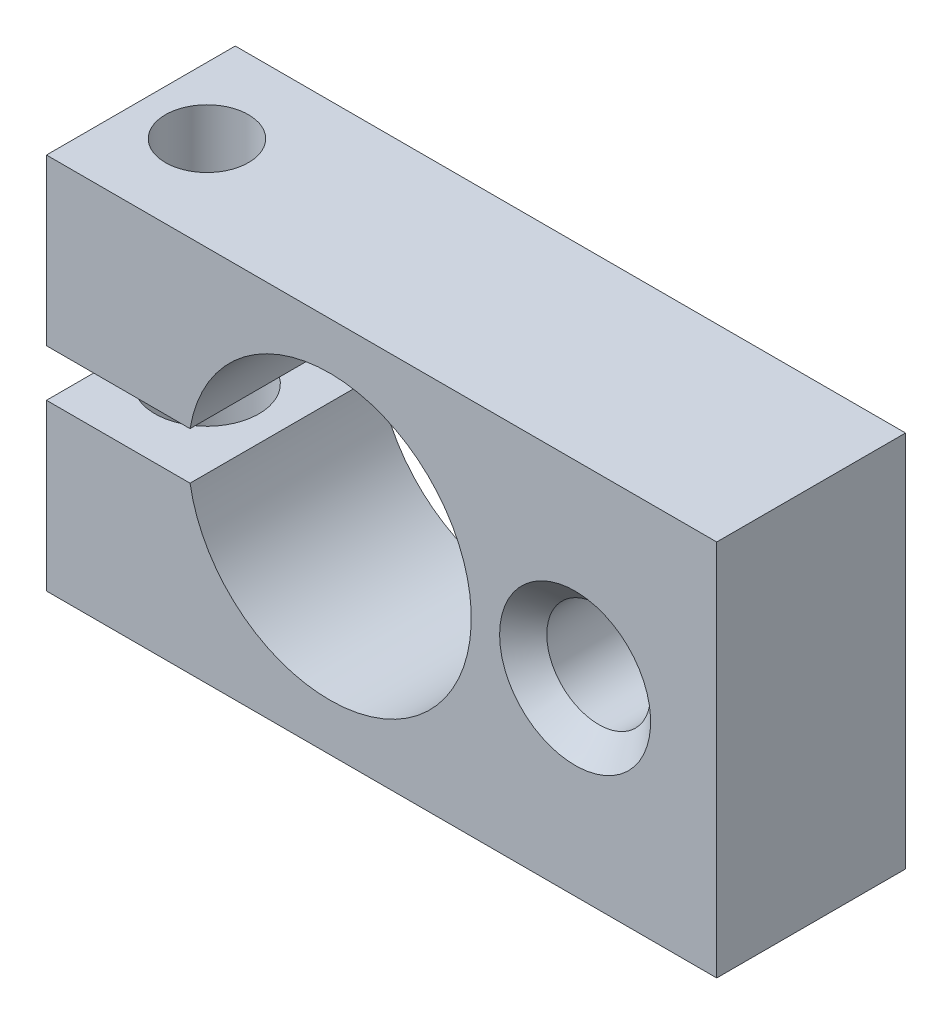
ISO-10303-21;
HEADER;
FILE_DESCRIPTION(('STEP AP214'),'2;1');
FILE_NAME('part.step','',(''),(''),'','','');
FILE_SCHEMA(('AUTOMOTIVE_DESIGN { 1 0 10303 214 1 1 1 1 }'));
ENDSEC;
DATA;
#1=APPLICATION_CONTEXT('core data for automotive mechanical design processes');
#2=APPLICATION_PROTOCOL_DEFINITION('international standard','automotive_design',2000,#1);
#3=PRODUCT_CONTEXT('',#1,'mechanical');
#4=PRODUCT('Part','Part','',(#3));
#5=PRODUCT_RELATED_PRODUCT_CATEGORY('part','',(#4));
#6=PRODUCT_DEFINITION_FORMATION('','',#4);
#7=PRODUCT_DEFINITION_CONTEXT('part definition',#1,'design');
#8=PRODUCT_DEFINITION('design','',#6,#7);
#9=PRODUCT_DEFINITION_SHAPE('','',#8);
#10=(LENGTH_UNIT() NAMED_UNIT(*) SI_UNIT(.MILLI.,.METRE.));
#11=(NAMED_UNIT(*) PLANE_ANGLE_UNIT() SI_UNIT($,.RADIAN.));
#12=(NAMED_UNIT(*) SI_UNIT($,.STERADIAN.) SOLID_ANGLE_UNIT());
#13=UNCERTAINTY_MEASURE_WITH_UNIT(LENGTH_MEASURE(1.E-05),#10,'distance_accuracy_value','');
#14=(GEOMETRIC_REPRESENTATION_CONTEXT(3) GLOBAL_UNCERTAINTY_ASSIGNED_CONTEXT((#13)) GLOBAL_UNIT_ASSIGNED_CONTEXT((#10,
#11,#12)) REPRESENTATION_CONTEXT('',''));
#15=CARTESIAN_POINT('',(0.,0.,0.));
#16=DIRECTION('',(0.,0.,1.));
#17=DIRECTION('',(1.,0.,0.));
#18=AXIS2_PLACEMENT_3D('',#15,#16,#17);
#19=CARTESIAN_POINT('',(-30.,-2.5,10.));
#20=DIRECTION('',(1.,0.,0.));
#21=DIRECTION('',(0.,0.,-1.));
#22=AXIS2_PLACEMENT_3D('',#19,#20,#21);
#23=PLANE('',#22);
#24=DIRECTION('',(0.,-1.,0.));
#25=VECTOR('',#24,1.);
#26=CARTESIAN_POINT('',(-30.,-2.50000000000002,-9.99999999999998));
#27=LINE('',#26,#25);
#28=CARTESIAN_POINT('',(-30.,-2.50000000000002,-9.99999999999998));
#29=VERTEX_POINT('',#28);
#30=CARTESIAN_POINT('',(-30.,-20.,-9.9999999999999));
#31=VERTEX_POINT('',#30);
#32=EDGE_CURVE('E86',#29,#31,#27,.T.);
#33=ORIENTED_EDGE('',*,*,#32,.T.);
#34=DIRECTION('',(0.,0.,-1.));
#35=VECTOR('',#34,1.);
#36=CARTESIAN_POINT('',(-30.,-20.,10.0000000000001));
#37=LINE('',#36,#35);
#38=CARTESIAN_POINT('',(-30.,-20.,10.0000000000001));
#39=VERTEX_POINT('',#38);
#40=EDGE_CURVE('E95',#39,#31,#37,.T.);
#41=ORIENTED_EDGE('',*,*,#40,.F.);
#42=DIRECTION('',(0.,-1.,0.));
#43=VECTOR('',#42,1.);
#44=CARTESIAN_POINT('',(-30.,-2.5,10.));
#45=LINE('',#44,#43);
#46=CARTESIAN_POINT('',(-30.,-2.5,10.));
#47=VERTEX_POINT('',#46);
#48=EDGE_CURVE('E120',#47,#39,#45,.T.);
#49=ORIENTED_EDGE('',*,*,#48,.F.);
#50=DIRECTION('',(0.,0.,-1.));
#51=VECTOR('',#50,1.);
#52=CARTESIAN_POINT('',(-30.,-2.5,10.));
#53=LINE('',#52,#51);
#54=EDGE_CURVE('E104',#47,#29,#53,.T.);
#55=ORIENTED_EDGE('',*,*,#54,.T.);
#56=EDGE_LOOP('',(#33,#41,#49,#55));
#57=FACE_BOUND('',#56,.T.);
#58=ADVANCED_FACE('F17',(#57),#23,.F.);
#59=CARTESIAN_POINT('',(-30.,-20.,10.0000000000001));
#60=DIRECTION('',(0.,1.,0.));
#61=DIRECTION('',(0.,0.,1.));
#62=AXIS2_PLACEMENT_3D('',#59,#60,#61);
#63=PLANE('',#62);
#64=CARTESIAN_POINT('',(-23.,-20.,1.11022302462516E-13));
#65=DIRECTION('',(0.,-1.,0.));
#66=DIRECTION('',(0.,0.,-1.));
#67=AXIS2_PLACEMENT_3D('',#64,#65,#66);
#68=CIRCLE('',#67,5.5);
#69=CARTESIAN_POINT('',(-23.,-20.,-5.49999999999989));
#70=VERTEX_POINT('',#69);
#71=EDGE_CURVE('E112',#70,#70,#68,.T.);
#72=ORIENTED_EDGE('',*,*,#71,.F.);
#73=EDGE_LOOP('',(#72));
#74=FACE_BOUND('',#73,.T.);
#75=DIRECTION('',(1.,0.,0.));
#76=VECTOR('',#75,1.);
#77=CARTESIAN_POINT('',(-30.,-20.,-9.9999999999999));
#78=LINE('',#77,#76);
#79=CARTESIAN_POINT('',(41.,-20.,-9.9999999999999));
#80=VERTEX_POINT('',#79);
#81=EDGE_CURVE('E81',#31,#80,#78,.T.);
#82=ORIENTED_EDGE('',*,*,#81,.T.);
#83=DIRECTION('',(0.,0.,-1.));
#84=VECTOR('',#83,1.);
#85=CARTESIAN_POINT('',(41.,-20.,10.0000000000001));
#86=LINE('',#85,#84);
#87=CARTESIAN_POINT('',(41.,-20.,10.0000000000001));
#88=VERTEX_POINT('',#87);
#89=EDGE_CURVE('E101',#88,#80,#86,.T.);
#90=ORIENTED_EDGE('',*,*,#89,.F.);
#91=DIRECTION('',(1.,0.,0.));
#92=VECTOR('',#91,1.);
#93=CARTESIAN_POINT('',(-30.,-20.,10.0000000000001));
#94=LINE('',#93,#92);
#95=EDGE_CURVE('E97',#39,#88,#94,.T.);
#96=ORIENTED_EDGE('',*,*,#95,.F.);
#97=ORIENTED_EDGE('',*,*,#40,.T.);
#98=EDGE_LOOP('',(#82,#90,#96,#97));
#99=FACE_BOUND('',#98,.T.);
#100=ADVANCED_FACE('F96',(#74,#99),#63,.F.);
#101=CARTESIAN_POINT('',(41.,-20.,10.0000000000001));
#102=DIRECTION('',(-1.,0.,0.));
#103=DIRECTION('',(0.,0.,1.));
#104=AXIS2_PLACEMENT_3D('',#101,#102,#103);
#105=PLANE('',#104);
#106=DIRECTION('',(0.,1.,0.));
#107=VECTOR('',#106,1.);
#108=CARTESIAN_POINT('',(41.,-20.,-9.9999999999999));
#109=LINE('',#108,#107);
#110=CARTESIAN_POINT('',(41.,20.,-9.99999999999998));
#111=VERTEX_POINT('',#110);
#112=EDGE_CURVE('E88',#80,#111,#109,.T.);
#113=ORIENTED_EDGE('',*,*,#112,.T.);
#114=DIRECTION('',(0.,0.,-1.));
#115=VECTOR('',#114,1.);
#116=CARTESIAN_POINT('',(41.,20.,10.));
#117=LINE('',#116,#115);
#118=CARTESIAN_POINT('',(41.,20.,10.));
#119=VERTEX_POINT('',#118);
#120=EDGE_CURVE('E144',#119,#111,#117,.T.);
#121=ORIENTED_EDGE('',*,*,#120,.F.);
#122=DIRECTION('',(0.,1.,0.));
#123=VECTOR('',#122,1.);
#124=CARTESIAN_POINT('',(41.,-20.,10.0000000000001));
#125=LINE('',#124,#123);
#126=EDGE_CURVE('E119',#88,#119,#125,.T.);
#127=ORIENTED_EDGE('',*,*,#126,.F.);
#128=ORIENTED_EDGE('',*,*,#89,.T.);
#129=EDGE_LOOP('',(#113,#121,#127,#128));
#130=FACE_BOUND('',#129,.T.);
#131=ADVANCED_FACE('F183',(#130),#105,.F.);
#132=CARTESIAN_POINT('',(41.,20.,10.));
#133=DIRECTION('',(0.,-1.,0.));
#134=DIRECTION('',(0.,0.,-1.));
#135=AXIS2_PLACEMENT_3D('',#132,#133,#134);
#136=PLANE('',#135);
#137=CARTESIAN_POINT('',(-23.,20.,1.11022302462516E-13));
#138=DIRECTION('',(0.,1.,0.));
#139=DIRECTION('',(0.,0.,1.));
#140=AXIS2_PLACEMENT_3D('',#137,#138,#139);
#141=CIRCLE('',#140,4.4);
#142=CARTESIAN_POINT('',(-23.,20.,4.40000000000011));
#143=VERTEX_POINT('',#142);
#144=EDGE_CURVE('E223',#143,#143,#141,.T.);
#145=ORIENTED_EDGE('',*,*,#144,.F.);
#146=EDGE_LOOP('',(#145));
#147=FACE_BOUND('',#146,.T.);
#148=DIRECTION('',(-1.,0.,0.));
#149=VECTOR('',#148,1.);
#150=CARTESIAN_POINT('',(41.,20.,-9.99999999999998));
#151=LINE('',#150,#149);
#152=CARTESIAN_POINT('',(-30.,20.,-9.9999999999999));
#153=VERTEX_POINT('',#152);
#154=EDGE_CURVE('E213',#111,#153,#151,.T.);
#155=ORIENTED_EDGE('',*,*,#154,.T.);
#156=DIRECTION('',(0.,0.,-1.));
#157=VECTOR('',#156,1.);
#158=CARTESIAN_POINT('',(-30.,20.,10.0000000000001));
#159=LINE('',#158,#157);
#160=CARTESIAN_POINT('',(-30.,20.,10.0000000000001));
#161=VERTEX_POINT('',#160);
#162=EDGE_CURVE('E141',#161,#153,#159,.T.);
#163=ORIENTED_EDGE('',*,*,#162,.F.);
#164=DIRECTION('',(-1.,0.,0.));
#165=VECTOR('',#164,1.);
#166=CARTESIAN_POINT('',(41.,20.,10.));
#167=LINE('',#166,#165);
#168=EDGE_CURVE('E122',#119,#161,#167,.T.);
#169=ORIENTED_EDGE('',*,*,#168,.F.);
#170=ORIENTED_EDGE('',*,*,#120,.T.);
#171=EDGE_LOOP('',(#155,#163,#169,#170));
#172=FACE_BOUND('',#171,.T.);
#173=ADVANCED_FACE('F187',(#147,#172),#136,.F.);
#174=CARTESIAN_POINT('',(-30.,20.,10.0000000000001));
#175=DIRECTION('',(1.,0.,0.));
#176=DIRECTION('',(0.,0.,-1.));
#177=AXIS2_PLACEMENT_3D('',#174,#175,#176);
#178=PLANE('',#177);
#179=DIRECTION('',(0.,-1.,0.));
#180=VECTOR('',#179,1.);
#181=CARTESIAN_POINT('',(-30.,20.,-9.9999999999999));
#182=LINE('',#181,#180);
#183=CARTESIAN_POINT('',(-30.,2.5,-9.9999999999999));
#184=VERTEX_POINT('',#183);
#185=EDGE_CURVE('E195',#153,#184,#182,.T.);
#186=ORIENTED_EDGE('',*,*,#185,.T.);
#187=DIRECTION('',(0.,0.,-1.));
#188=VECTOR('',#187,1.);
#189=CARTESIAN_POINT('',(-30.,2.5,10.0000000000001));
#190=LINE('',#189,#188);
#191=CARTESIAN_POINT('',(-30.,2.5,10.0000000000001));
#192=VERTEX_POINT('',#191);
#193=EDGE_CURVE('E138',#192,#184,#190,.T.);
#194=ORIENTED_EDGE('',*,*,#193,.F.);
#195=DIRECTION('',(0.,-1.,0.));
#196=VECTOR('',#195,1.);
#197=CARTESIAN_POINT('',(-30.,20.,10.0000000000001));
#198=LINE('',#197,#196);
#199=EDGE_CURVE('E124',#161,#192,#198,.T.);
#200=ORIENTED_EDGE('',*,*,#199,.F.);
#201=ORIENTED_EDGE('',*,*,#162,.T.);
#202=EDGE_LOOP('',(#186,#194,#200,#201));
#203=FACE_BOUND('',#202,.T.);
#204=ADVANCED_FACE('F193',(#203),#178,.F.);
#205=CARTESIAN_POINT('',(-30.,2.5,10.0000000000001));
#206=DIRECTION('',(0.,1.,0.));
#207=DIRECTION('',(0.,0.,1.));
#208=AXIS2_PLACEMENT_3D('',#205,#206,#207);
#209=PLANE('',#208);
#210=CARTESIAN_POINT('',(-23.,2.5,1.11022302462516E-13));
#211=DIRECTION('',(0.,1.,0.));
#212=DIRECTION('',(0.,0.,1.));
#213=AXIS2_PLACEMENT_3D('',#210,#211,#212);
#214=CIRCLE('',#213,4.4);
#215=CARTESIAN_POINT('',(-23.,2.5,4.40000000000011));
#216=VERTEX_POINT('',#215);
#217=EDGE_CURVE('E220',#216,#216,#214,.T.);
#218=ORIENTED_EDGE('',*,*,#217,.T.);
#219=EDGE_LOOP('',(#218));
#220=FACE_BOUND('',#219,.T.);
#221=DIRECTION('',(1.,0.,0.));
#222=VECTOR('',#221,1.);
#223=CARTESIAN_POINT('',(-30.,2.5,-9.9999999999999));
#224=LINE('',#223,#222);
#225=CARTESIAN_POINT('',(-14.790199457749,2.50000000000001,-9.9999999999999));
#226=VERTEX_POINT('',#225);
#227=EDGE_CURVE('E199',#184,#226,#224,.T.);
#228=ORIENTED_EDGE('',*,*,#227,.T.);
#229=DIRECTION('',(0.,0.,-1.));
#230=VECTOR('',#229,1.);
#231=CARTESIAN_POINT('',(-14.790199457749,2.5,10.0000000000001));
#232=LINE('',#231,#230);
#233=CARTESIAN_POINT('',(-14.790199457749,2.5,10.0000000000001));
#234=VERTEX_POINT('',#233);
#235=EDGE_CURVE('E135',#234,#226,#232,.T.);
#236=ORIENTED_EDGE('',*,*,#235,.F.);
#237=DIRECTION('',(1.,0.,0.));
#238=VECTOR('',#237,1.);
#239=CARTESIAN_POINT('',(-30.,2.5,10.0000000000001));
#240=LINE('',#239,#238);
#241=EDGE_CURVE('E126',#192,#234,#240,.T.);
#242=ORIENTED_EDGE('',*,*,#241,.F.);
#243=ORIENTED_EDGE('',*,*,#193,.T.);
#244=EDGE_LOOP('',(#228,#236,#242,#243));
#245=FACE_BOUND('',#244,.T.);
#246=ADVANCED_FACE('F198',(#220,#245),#209,.F.);
#247=CARTESIAN_POINT('',(0.,0.,10.));
#248=DIRECTION('',(0.,0.,-1.));
#249=DIRECTION('',(-1.,0.,0.));
#250=AXIS2_PLACEMENT_3D('',#247,#248,#249);
#251=CYLINDRICAL_SURFACE('',#250,15.);
#252=CARTESIAN_POINT('',(0.,0.,-10.));
#253=DIRECTION('',(0.,0.,-1.));
#254=DIRECTION('',(-1.,0.,0.));
#255=AXIS2_PLACEMENT_3D('',#252,#253,#254);
#256=CIRCLE('',#255,15.);
#257=CARTESIAN_POINT('',(-14.790199457749,-2.5,-9.9999999999999));
#258=VERTEX_POINT('',#257);
#259=EDGE_CURVE('E202',#226,#258,#256,.T.);
#260=ORIENTED_EDGE('',*,*,#259,.T.);
#261=DIRECTION('',(0.,0.,-1.));
#262=VECTOR('',#261,1.);
#263=CARTESIAN_POINT('',(-14.790199457749,-2.50000000000001,10.0000000000001));
#264=LINE('',#263,#262);
#265=CARTESIAN_POINT('',(-14.790199457749,-2.50000000000001,10.0000000000001));
#266=VERTEX_POINT('',#265);
#267=EDGE_CURVE('E132',#266,#258,#264,.T.);
#268=ORIENTED_EDGE('',*,*,#267,.F.);
#269=CARTESIAN_POINT('',(0.,0.,10.));
#270=DIRECTION('',(0.,0.,-1.));
#271=DIRECTION('',(-1.,0.,0.));
#272=AXIS2_PLACEMENT_3D('',#269,#270,#271);
#273=CIRCLE('',#272,15.);
#274=EDGE_CURVE('E36',#234,#266,#273,.T.);
#275=ORIENTED_EDGE('',*,*,#274,.F.);
#276=ORIENTED_EDGE('',*,*,#235,.T.);
#277=EDGE_LOOP('',(#260,#268,#275,#276));
#278=FACE_BOUND('',#277,.T.);
#279=ADVANCED_FACE('F167',(#278),#251,.F.);
#280=CARTESIAN_POINT('',(26.,0.,10.));
#281=DIRECTION('',(0.,0.,-1.));
#282=DIRECTION('',(-1.,0.,0.));
#283=AXIS2_PLACEMENT_3D('',#280,#281,#282);
#284=CYLINDRICAL_SURFACE('',#283,5.5);
#285=CARTESIAN_POINT('',(26.,0.,-7.49999999999998));
#286=DIRECTION('',(0.,0.,-1.));
#287=DIRECTION('',(-1.,0.,0.));
#288=AXIS2_PLACEMENT_3D('',#285,#286,#287);
#289=CIRCLE('',#288,5.5);
#290=CARTESIAN_POINT('',(20.5,0.,-7.49999999999998));
#291=VERTEX_POINT('',#290);
#292=EDGE_CURVE('E150',#291,#291,#289,.T.);
#293=ORIENTED_EDGE('',*,*,#292,.T.);
#294=EDGE_LOOP('',(#293));
#295=FACE_BOUND('',#294,.T.);
#296=CARTESIAN_POINT('',(26.,0.,7.50000000000001));
#297=DIRECTION('',(0.,0.,-1.));
#298=DIRECTION('',(-1.,0.,0.));
#299=AXIS2_PLACEMENT_3D('',#296,#297,#298);
#300=CIRCLE('',#299,5.5);
#301=CARTESIAN_POINT('',(20.5,0.,7.50000000000001));
#302=VERTEX_POINT('',#301);
#303=EDGE_CURVE('E100',#302,#302,#300,.F.);
#304=ORIENTED_EDGE('',*,*,#303,.T.);
#305=EDGE_LOOP('',(#304));
#306=FACE_BOUND('',#305,.T.);
#307=ADVANCED_FACE('F163',(#295,#306),#284,.F.);
#308=CARTESIAN_POINT('',(-30.,-2.5,10.));
#309=DIRECTION('',(0.,-1.,0.));
#310=DIRECTION('',(0.,0.,-1.));
#311=AXIS2_PLACEMENT_3D('',#308,#309,#310);
#312=PLANE('',#311);
#313=CARTESIAN_POINT('',(-23.,-2.5,1.11022302462516E-13));
#314=DIRECTION('',(0.,-1.,0.));
#315=DIRECTION('',(0.,0.,-1.));
#316=AXIS2_PLACEMENT_3D('',#313,#314,#315);
#317=CIRCLE('',#316,5.5);
#318=CARTESIAN_POINT('',(-23.,-2.5,-5.49999999999989));
#319=VERTEX_POINT('',#318);
#320=EDGE_CURVE('E106',#319,#319,#317,.T.);
#321=ORIENTED_EDGE('',*,*,#320,.T.);
#322=EDGE_LOOP('',(#321));
#323=FACE_BOUND('',#322,.T.);
#324=DIRECTION('',(-1.,0.,0.));
#325=VECTOR('',#324,1.);
#326=CARTESIAN_POINT('',(-30.,-2.50000000000002,-9.99999999999998));
#327=LINE('',#326,#325);
#328=EDGE_CURVE('E116',#258,#29,#327,.T.);
#329=ORIENTED_EDGE('',*,*,#328,.T.);
#330=ORIENTED_EDGE('',*,*,#54,.F.);
#331=DIRECTION('',(-1.,0.,0.));
#332=VECTOR('',#331,1.);
#333=CARTESIAN_POINT('',(-30.,-2.5,10.));
#334=LINE('',#333,#332);
#335=EDGE_CURVE('E31',#266,#47,#334,.T.);
#336=ORIENTED_EDGE('',*,*,#335,.F.);
#337=ORIENTED_EDGE('',*,*,#267,.T.);
#338=EDGE_LOOP('',(#329,#330,#336,#337));
#339=FACE_BOUND('',#338,.T.);
#340=ADVANCED_FACE('F166',(#323,#339),#312,.F.);
#341=CARTESIAN_POINT('',(0.,0.,10.));
#342=DIRECTION('',(0.,0.,-1.));
#343=DIRECTION('',(-1.,0.,0.));
#344=AXIS2_PLACEMENT_3D('',#341,#342,#343);
#345=PLANE('',#344);
#346=CARTESIAN_POINT('',(26.,0.,10.));
#347=DIRECTION('',(0.,0.,-1.));
#348=DIRECTION('',(-1.,0.,0.));
#349=AXIS2_PLACEMENT_3D('',#346,#347,#348);
#350=CIRCLE('',#349,8.);
#351=CARTESIAN_POINT('',(18.,0.,10.));
#352=VERTEX_POINT('',#351);
#353=EDGE_CURVE('E11',#352,#352,#350,.T.);
#354=ORIENTED_EDGE('',*,*,#353,.T.);
#355=EDGE_LOOP('',(#354));
#356=FACE_BOUND('',#355,.T.);
#357=ORIENTED_EDGE('',*,*,#48,.T.);
#358=ORIENTED_EDGE('',*,*,#95,.T.);
#359=ORIENTED_EDGE('',*,*,#126,.T.);
#360=ORIENTED_EDGE('',*,*,#168,.T.);
#361=ORIENTED_EDGE('',*,*,#199,.T.);
#362=ORIENTED_EDGE('',*,*,#241,.T.);
#363=ORIENTED_EDGE('',*,*,#274,.T.);
#364=ORIENTED_EDGE('',*,*,#335,.T.);
#365=EDGE_LOOP('',(#357,#358,#359,#360,#361,#362,#363,#364));
#366=FACE_BOUND('',#365,.T.);
#367=ADVANCED_FACE('F177',(#356,#366),#345,.F.);
#368=CARTESIAN_POINT('',(0.,0.,-10.));
#369=DIRECTION('',(0.,0.,-1.));
#370=DIRECTION('',(-1.,0.,0.));
#371=AXIS2_PLACEMENT_3D('',#368,#369,#370);
#372=PLANE('',#371);
#373=CARTESIAN_POINT('',(26.,0.,-9.99999999999998));
#374=DIRECTION('',(0.,0.,-1.));
#375=DIRECTION('',(-1.,0.,0.));
#376=AXIS2_PLACEMENT_3D('',#373,#374,#375);
#377=CIRCLE('',#376,8.);
#378=CARTESIAN_POINT('',(18.,0.,-9.99999999999998));
#379=VERTEX_POINT('',#378);
#380=EDGE_CURVE('E24',#379,#379,#377,.F.);
#381=ORIENTED_EDGE('',*,*,#380,.T.);
#382=EDGE_LOOP('',(#381));
#383=FACE_BOUND('',#382,.T.);
#384=ORIENTED_EDGE('',*,*,#32,.F.);
#385=ORIENTED_EDGE('',*,*,#328,.F.);
#386=ORIENTED_EDGE('',*,*,#259,.F.);
#387=ORIENTED_EDGE('',*,*,#227,.F.);
#388=ORIENTED_EDGE('',*,*,#185,.F.);
#389=ORIENTED_EDGE('',*,*,#154,.F.);
#390=ORIENTED_EDGE('',*,*,#112,.F.);
#391=ORIENTED_EDGE('',*,*,#81,.F.);
#392=EDGE_LOOP('',(#384,#385,#386,#387,#388,#389,#390,#391));
#393=FACE_BOUND('',#392,.T.);
#394=ADVANCED_FACE('F83',(#383,#393),#372,.T.);
#395=CARTESIAN_POINT('',(26.,0.,-7.49999999999998));
#396=DIRECTION('',(0.,0.,-1.));
#397=DIRECTION('',(-1.,0.,0.));
#398=AXIS2_PLACEMENT_3D('',#395,#396,#397);
#399=CONICAL_SURFACE('',#398,5.5,0.785398163397449);
#400=ORIENTED_EDGE('',*,*,#380,.F.);
#401=EDGE_LOOP('',(#400));
#402=FACE_BOUND('',#401,.T.);
#403=ORIENTED_EDGE('',*,*,#292,.F.);
#404=EDGE_LOOP('',(#403));
#405=FACE_BOUND('',#404,.T.);
#406=ADVANCED_FACE('F156',(#402,#405),#399,.F.);
#407=CARTESIAN_POINT('',(26.,0.,10.));
#408=DIRECTION('',(0.,0.,1.));
#409=DIRECTION('',(1.,0.,0.));
#410=AXIS2_PLACEMENT_3D('',#407,#408,#409);
#411=CONICAL_SURFACE('',#410,8.,0.785398163397448);
#412=ORIENTED_EDGE('',*,*,#303,.F.);
#413=EDGE_LOOP('',(#412));
#414=FACE_BOUND('',#413,.T.);
#415=ORIENTED_EDGE('',*,*,#353,.F.);
#416=EDGE_LOOP('',(#415));
#417=FACE_BOUND('',#416,.T.);
#418=ADVANCED_FACE('F159',(#414,#417),#411,.F.);
#419=CARTESIAN_POINT('',(-23.,63.9106667831928,0.));
#420=DIRECTION('',(0.,-1.,0.));
#421=DIRECTION('',(0.,0.,-1.));
#422=AXIS2_PLACEMENT_3D('',#419,#420,#421);
#423=CYLINDRICAL_SURFACE('',#422,5.5);
#424=ORIENTED_EDGE('',*,*,#320,.F.);
#425=EDGE_LOOP('',(#424));
#426=FACE_BOUND('',#425,.T.);
#427=ORIENTED_EDGE('',*,*,#71,.T.);
#428=EDGE_LOOP('',(#427));
#429=FACE_BOUND('',#428,.T.);
#430=ADVANCED_FACE('F173',(#426,#429),#423,.F.);
#431=CARTESIAN_POINT('',(-23.,-63.9106667831927,1.11022302462516E-13));
#432=DIRECTION('',(0.,1.,0.));
#433=DIRECTION('',(0.,0.,1.));
#434=AXIS2_PLACEMENT_3D('',#431,#432,#433);
#435=CYLINDRICAL_SURFACE('',#434,4.4);
#436=ORIENTED_EDGE('',*,*,#217,.F.);
#437=EDGE_LOOP('',(#436));
#438=FACE_BOUND('',#437,.T.);
#439=ORIENTED_EDGE('',*,*,#144,.T.);
#440=EDGE_LOOP('',(#439));
#441=FACE_BOUND('',#440,.T.);
#442=ADVANCED_FACE('F229',(#438,#441),#435,.F.);
#443=CLOSED_SHELL('',(#58,#100,#131,#173,#204,#246,#279,#307,#340,#367,#394,#406,#418,#430,#442));
#444=MANIFOLD_SOLID_BREP('B1',#443);
#445=ADVANCED_BREP_SHAPE_REPRESENTATION('',(#18,#444),#14);
#446=SHAPE_DEFINITION_REPRESENTATION(#9,#445);
ENDSEC;
END-ISO-10303-21;
